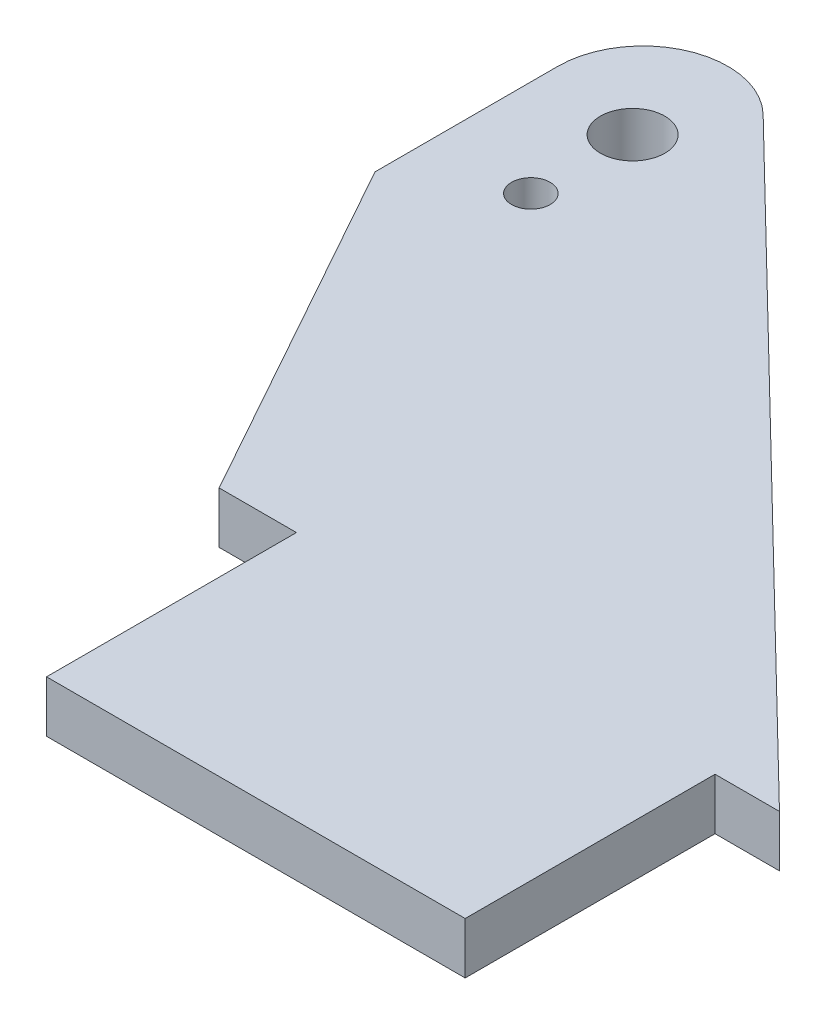
ISO-10303-21;
HEADER;
FILE_DESCRIPTION(('STEP AP214'),'2;1');
FILE_NAME('part.step','',(''),(''),'','','');
FILE_SCHEMA(('AUTOMOTIVE_DESIGN { 1 0 10303 214 1 1 1 1 }'));
ENDSEC;
DATA;
#1=APPLICATION_CONTEXT('core data for automotive mechanical design processes');
#2=APPLICATION_PROTOCOL_DEFINITION('international standard','automotive_design',2000,#1);
#3=PRODUCT_CONTEXT('',#1,'mechanical');
#4=PRODUCT('Part','Part','',(#3));
#5=PRODUCT_RELATED_PRODUCT_CATEGORY('part','',(#4));
#6=PRODUCT_DEFINITION_FORMATION('','',#4);
#7=PRODUCT_DEFINITION_CONTEXT('part definition',#1,'design');
#8=PRODUCT_DEFINITION('design','',#6,#7);
#9=PRODUCT_DEFINITION_SHAPE('','',#8);
#10=(LENGTH_UNIT() NAMED_UNIT(*) SI_UNIT(.MILLI.,.METRE.));
#11=(NAMED_UNIT(*) PLANE_ANGLE_UNIT() SI_UNIT($,.RADIAN.));
#12=(NAMED_UNIT(*) SI_UNIT($,.STERADIAN.) SOLID_ANGLE_UNIT());
#13=UNCERTAINTY_MEASURE_WITH_UNIT(LENGTH_MEASURE(1.E-05),#10,'distance_accuracy_value','');
#14=(GEOMETRIC_REPRESENTATION_CONTEXT(3) GLOBAL_UNCERTAINTY_ASSIGNED_CONTEXT((#13)) GLOBAL_UNIT_ASSIGNED_CONTEXT((#10,
#11,#12)) REPRESENTATION_CONTEXT('',''));
#15=CARTESIAN_POINT('',(0.,0.,0.));
#16=DIRECTION('',(0.,0.,1.));
#17=DIRECTION('',(1.,0.,0.));
#18=AXIS2_PLACEMENT_3D('',#15,#16,#17);
#19=CARTESIAN_POINT('',(0.,1.016,0.));
#20=DIRECTION('',(1.,0.,0.));
#21=DIRECTION('',(0.,0.,-1.));
#22=AXIS2_PLACEMENT_3D('',#19,#20,#21);
#23=PLANE('',#22);
#24=DIRECTION('',(0.,0.,1.));
#25=VECTOR('',#24,1.);
#26=CARTESIAN_POINT('',(0.,0.,0.));
#27=LINE('',#26,#25);
#28=CARTESIAN_POINT('',(0.,0.,-4.9276));
#29=VERTEX_POINT('',#28);
#30=CARTESIAN_POINT('',(0.,0.,0.));
#31=VERTEX_POINT('',#30);
#32=EDGE_CURVE('E139',#29,#31,#27,.T.);
#33=ORIENTED_EDGE('',*,*,#32,.T.);
#34=DIRECTION('',(0.,-1.,0.));
#35=VECTOR('',#34,1.);
#36=CARTESIAN_POINT('',(0.,1.016,0.));
#37=LINE('',#36,#35);
#38=CARTESIAN_POINT('',(0.,1.016,0.));
#39=VERTEX_POINT('',#38);
#40=EDGE_CURVE('E11',#39,#31,#37,.T.);
#41=ORIENTED_EDGE('',*,*,#40,.F.);
#42=DIRECTION('',(0.,0.,1.));
#43=VECTOR('',#42,1.);
#44=CARTESIAN_POINT('',(0.,1.016,0.));
#45=LINE('',#44,#43);
#46=CARTESIAN_POINT('',(0.,1.016,-4.9276));
#47=VERTEX_POINT('',#46);
#48=EDGE_CURVE('E156',#47,#39,#45,.T.);
#49=ORIENTED_EDGE('',*,*,#48,.F.);
#50=DIRECTION('',(0.,-1.,0.));
#51=VECTOR('',#50,1.);
#52=CARTESIAN_POINT('',(0.,1.016,-4.9276));
#53=LINE('',#52,#51);
#54=EDGE_CURVE('E135',#47,#29,#53,.T.);
#55=ORIENTED_EDGE('',*,*,#54,.T.);
#56=EDGE_LOOP('',(#33,#41,#49,#55));
#57=FACE_BOUND('',#56,.T.);
#58=ADVANCED_FACE('F37',(#57),#23,.F.);
#59=CARTESIAN_POINT('',(0.,1.016,0.));
#60=DIRECTION('',(0.,0.,-1.));
#61=DIRECTION('',(-1.,0.,0.));
#62=AXIS2_PLACEMENT_3D('',#59,#60,#61);
#63=PLANE('',#62);
#64=DIRECTION('',(1.,0.,0.));
#65=VECTOR('',#64,1.);
#66=CARTESIAN_POINT('',(0.,0.,0.));
#67=LINE('',#66,#65);
#68=CARTESIAN_POINT('',(8.255,0.,0.));
#69=VERTEX_POINT('',#68);
#70=EDGE_CURVE('E142',#31,#69,#67,.T.);
#71=ORIENTED_EDGE('',*,*,#70,.T.);
#72=DIRECTION('',(0.,-1.,0.));
#73=VECTOR('',#72,1.);
#74=CARTESIAN_POINT('',(8.255,1.016,0.));
#75=LINE('',#74,#73);
#76=CARTESIAN_POINT('',(8.255,1.016,0.));
#77=VERTEX_POINT('',#76);
#78=EDGE_CURVE('E45',#77,#69,#75,.T.);
#79=ORIENTED_EDGE('',*,*,#78,.F.);
#80=DIRECTION('',(1.,0.,0.));
#81=VECTOR('',#80,1.);
#82=CARTESIAN_POINT('',(0.,1.016,0.));
#83=LINE('',#82,#81);
#84=EDGE_CURVE('E99',#39,#77,#83,.T.);
#85=ORIENTED_EDGE('',*,*,#84,.F.);
#86=ORIENTED_EDGE('',*,*,#40,.T.);
#87=EDGE_LOOP('',(#71,#79,#85,#86));
#88=FACE_BOUND('',#87,.T.);
#89=ADVANCED_FACE('F233',(#88),#63,.F.);
#90=CARTESIAN_POINT('',(8.255,1.016,0.));
#91=DIRECTION('',(-1.,0.,0.));
#92=DIRECTION('',(0.,0.,1.));
#93=AXIS2_PLACEMENT_3D('',#90,#91,#92);
#94=PLANE('',#93);
#95=DIRECTION('',(0.,0.,-1.));
#96=VECTOR('',#95,1.);
#97=CARTESIAN_POINT('',(8.255,0.,0.));
#98=LINE('',#97,#96);
#99=CARTESIAN_POINT('',(8.255,0.,-4.9276));
#100=VERTEX_POINT('',#99);
#101=EDGE_CURVE('E145',#69,#100,#98,.T.);
#102=ORIENTED_EDGE('',*,*,#101,.T.);
#103=DIRECTION('',(0.,-1.,0.));
#104=VECTOR('',#103,1.);
#105=CARTESIAN_POINT('',(8.255,1.016,-4.9276));
#106=LINE('',#105,#104);
#107=CARTESIAN_POINT('',(8.255,1.016,-4.9276));
#108=VERTEX_POINT('',#107);
#109=EDGE_CURVE('E166',#108,#100,#106,.T.);
#110=ORIENTED_EDGE('',*,*,#109,.F.);
#111=DIRECTION('',(0.,0.,-1.));
#112=VECTOR('',#111,1.);
#113=CARTESIAN_POINT('',(8.255,1.016,0.));
#114=LINE('',#113,#112);
#115=EDGE_CURVE('E174',#77,#108,#114,.T.);
#116=ORIENTED_EDGE('',*,*,#115,.F.);
#117=ORIENTED_EDGE('',*,*,#78,.T.);
#118=EDGE_LOOP('',(#102,#110,#116,#117));
#119=FACE_BOUND('',#118,.T.);
#120=ADVANCED_FACE('F172',(#119),#94,.F.);
#121=CARTESIAN_POINT('',(8.255,1.016,-4.9276));
#122=DIRECTION('',(0.,0.,-1.));
#123=DIRECTION('',(-1.,0.,0.));
#124=AXIS2_PLACEMENT_3D('',#121,#122,#123);
#125=PLANE('',#124);
#126=DIRECTION('',(1.,0.,0.));
#127=VECTOR('',#126,1.);
#128=CARTESIAN_POINT('',(8.255,0.,-4.9276));
#129=LINE('',#128,#127);
#130=CARTESIAN_POINT('',(9.525,0.,-4.9276));
#131=VERTEX_POINT('',#130);
#132=EDGE_CURVE('E147',#100,#131,#129,.T.);
#133=ORIENTED_EDGE('',*,*,#132,.T.);
#134=DIRECTION('',(0.,-1.,0.));
#135=VECTOR('',#134,1.);
#136=CARTESIAN_POINT('',(9.525,1.016,-4.9276));
#137=LINE('',#136,#135);
#138=CARTESIAN_POINT('',(9.525,1.016,-4.9276));
#139=VERTEX_POINT('',#138);
#140=EDGE_CURVE('E163',#139,#131,#137,.T.);
#141=ORIENTED_EDGE('',*,*,#140,.F.);
#142=DIRECTION('',(1.,0.,0.));
#143=VECTOR('',#142,1.);
#144=CARTESIAN_POINT('',(8.255,1.016,-4.9276));
#145=LINE('',#144,#143);
#146=EDGE_CURVE('E190',#108,#139,#145,.T.);
#147=ORIENTED_EDGE('',*,*,#146,.F.);
#148=ORIENTED_EDGE('',*,*,#109,.T.);
#149=EDGE_LOOP('',(#133,#141,#147,#148));
#150=FACE_BOUND('',#149,.T.);
#151=ADVANCED_FACE('F183',(#150),#125,.F.);
#152=CARTESIAN_POINT('',(9.525,1.016,-4.9276));
#153=DIRECTION('',(-0.69748398227147,0.,0.716600372923942));
#154=DIRECTION('',(0.716600372923942,0.,0.69748398227147));
#155=AXIS2_PLACEMENT_3D('',#152,#153,#154);
#156=PLANE('',#155);
#157=DIRECTION('',(-0.716600372923942,0.,-0.69748398227147));
#158=VECTOR('',#157,1.);
#159=CARTESIAN_POINT('',(9.525,0.,-4.9276));
#160=LINE('',#159,#158);
#161=CARTESIAN_POINT('',(-2.5391378521201,0.,-16.6699088651697));
#162=VERTEX_POINT('',#161);
#163=EDGE_CURVE('E149',#131,#162,#160,.T.);
#164=ORIENTED_EDGE('',*,*,#163,.T.);
#165=DIRECTION('',(0.,-1.,0.));
#166=VECTOR('',#165,1.);
#167=CARTESIAN_POINT('',(-2.5391378521201,1.016,-16.6699088651697));
#168=LINE('',#167,#166);
#169=CARTESIAN_POINT('',(-2.5391378521201,1.016,-16.6699088651697));
#170=VERTEX_POINT('',#169);
#171=EDGE_CURVE('E160',#170,#162,#168,.T.);
#172=ORIENTED_EDGE('',*,*,#171,.F.);
#173=DIRECTION('',(-0.716600372923942,0.,-0.69748398227147));
#174=VECTOR('',#173,1.);
#175=CARTESIAN_POINT('',(9.525,1.016,-4.9276));
#176=LINE('',#175,#174);
#177=EDGE_CURVE('E189',#139,#170,#176,.T.);
#178=ORIENTED_EDGE('',*,*,#177,.F.);
#179=ORIENTED_EDGE('',*,*,#140,.T.);
#180=EDGE_LOOP('',(#164,#172,#178,#179));
#181=FACE_BOUND('',#180,.T.);
#182=ADVANCED_FACE('F187',(#181),#156,.F.);
#183=CARTESIAN_POINT('',(-3.7084,1.016,-15.4686));
#184=DIRECTION('',(0.,-1.,0.));
#185=DIRECTION('',(0.,0.,-1.));
#186=AXIS2_PLACEMENT_3D('',#183,#184,#185);
#187=CYLINDRICAL_SURFACE('',#186,1.6764);
#188=CARTESIAN_POINT('',(-3.7084,0.,-15.4686));
#189=DIRECTION('',(0.,1.,0.));
#190=DIRECTION('',(0.,0.,-1.));
#191=AXIS2_PLACEMENT_3D('',#188,#189,#190);
#192=CIRCLE('',#191,1.6764);
#193=CARTESIAN_POINT('',(-5.38479999999999,0.,-15.4686));
#194=VERTEX_POINT('',#193);
#195=EDGE_CURVE('E151',#162,#194,#192,.T.);
#196=ORIENTED_EDGE('',*,*,#195,.T.);
#197=DIRECTION('',(0.,-1.,0.));
#198=VECTOR('',#197,1.);
#199=CARTESIAN_POINT('',(-5.38479999999999,1.016,-15.4686));
#200=LINE('',#199,#198);
#201=CARTESIAN_POINT('',(-5.38479999999999,1.016,-15.4686));
#202=VERTEX_POINT('',#201);
#203=EDGE_CURVE('E130',#202,#194,#200,.T.);
#204=ORIENTED_EDGE('',*,*,#203,.F.);
#205=CARTESIAN_POINT('',(-3.7084,1.016,-15.4686));
#206=DIRECTION('',(0.,1.,0.));
#207=DIRECTION('',(0.,0.,-1.));
#208=AXIS2_PLACEMENT_3D('',#205,#206,#207);
#209=CIRCLE('',#208,1.6764);
#210=EDGE_CURVE('E121',#170,#202,#209,.T.);
#211=ORIENTED_EDGE('',*,*,#210,.F.);
#212=ORIENTED_EDGE('',*,*,#171,.T.);
#213=EDGE_LOOP('',(#196,#204,#211,#212));
#214=FACE_BOUND('',#213,.T.);
#215=ADVANCED_FACE('F241',(#214),#187,.T.);
#216=CARTESIAN_POINT('',(-5.3848,1.016,-11.8618));
#217=DIRECTION('',(1.,0.,0.));
#218=DIRECTION('',(0.,0.,-1.));
#219=AXIS2_PLACEMENT_3D('',#216,#217,#218);
#220=PLANE('',#219);
#221=DIRECTION('',(0.,0.,1.));
#222=VECTOR('',#221,1.);
#223=CARTESIAN_POINT('',(-5.3848,0.,-11.8618));
#224=LINE('',#223,#222);
#225=CARTESIAN_POINT('',(-5.3848,0.,-11.8618));
#226=VERTEX_POINT('',#225);
#227=EDGE_CURVE('E129',#194,#226,#224,.T.);
#228=ORIENTED_EDGE('',*,*,#227,.T.);
#229=DIRECTION('',(0.,-1.,0.));
#230=VECTOR('',#229,1.);
#231=CARTESIAN_POINT('',(-5.3848,1.016,-11.8618));
#232=LINE('',#231,#230);
#233=CARTESIAN_POINT('',(-5.3848,1.016,-11.8618));
#234=VERTEX_POINT('',#233);
#235=EDGE_CURVE('E126',#234,#226,#232,.T.);
#236=ORIENTED_EDGE('',*,*,#235,.F.);
#237=DIRECTION('',(0.,0.,1.));
#238=VECTOR('',#237,1.);
#239=CARTESIAN_POINT('',(-5.3848,1.016,-11.8618));
#240=LINE('',#239,#238);
#241=EDGE_CURVE('E115',#202,#234,#240,.T.);
#242=ORIENTED_EDGE('',*,*,#241,.F.);
#243=ORIENTED_EDGE('',*,*,#203,.T.);
#244=EDGE_LOOP('',(#228,#236,#242,#243));
#245=FACE_BOUND('',#244,.T.);
#246=ADVANCED_FACE('F127',(#245),#220,.F.);
#247=CARTESIAN_POINT('',(-1.524,1.016,-4.9276));
#248=DIRECTION('',(0.873704011916736,0.,-0.486457911396864));
#249=DIRECTION('',(-0.486457911396864,0.,-0.873704011916737));
#250=AXIS2_PLACEMENT_3D('',#247,#248,#249);
#251=PLANE('',#250);
#252=DIRECTION('',(0.486457911396864,0.,0.873704011916736));
#253=VECTOR('',#252,1.);
#254=CARTESIAN_POINT('',(-1.524,0.,-4.9276));
#255=LINE('',#254,#253);
#256=CARTESIAN_POINT('',(-1.524,0.,-4.9276));
#257=VERTEX_POINT('',#256);
#258=EDGE_CURVE('E85',#226,#257,#255,.T.);
#259=ORIENTED_EDGE('',*,*,#258,.T.);
#260=DIRECTION('',(0.,-1.,0.));
#261=VECTOR('',#260,1.);
#262=CARTESIAN_POINT('',(-1.524,1.016,-4.9276));
#263=LINE('',#262,#261);
#264=CARTESIAN_POINT('',(-1.524,1.016,-4.9276));
#265=VERTEX_POINT('',#264);
#266=EDGE_CURVE('E131',#265,#257,#263,.T.);
#267=ORIENTED_EDGE('',*,*,#266,.F.);
#268=DIRECTION('',(0.486457911396864,0.,0.873704011916736));
#269=VECTOR('',#268,1.);
#270=CARTESIAN_POINT('',(-1.524,1.016,-4.9276));
#271=LINE('',#270,#269);
#272=EDGE_CURVE('E119',#234,#265,#271,.T.);
#273=ORIENTED_EDGE('',*,*,#272,.F.);
#274=ORIENTED_EDGE('',*,*,#235,.T.);
#275=EDGE_LOOP('',(#259,#267,#273,#274));
#276=FACE_BOUND('',#275,.T.);
#277=ADVANCED_FACE('F133',(#276),#251,.F.);
#278=CARTESIAN_POINT('',(0.,1.016,-4.9276));
#279=DIRECTION('',(0.,0.,-1.));
#280=DIRECTION('',(-1.,0.,0.));
#281=AXIS2_PLACEMENT_3D('',#278,#279,#280);
#282=PLANE('',#281);
#283=DIRECTION('',(1.,0.,0.));
#284=VECTOR('',#283,1.);
#285=CARTESIAN_POINT('',(0.,0.,-4.9276));
#286=LINE('',#285,#284);
#287=EDGE_CURVE('E91',#257,#29,#286,.T.);
#288=ORIENTED_EDGE('',*,*,#287,.T.);
#289=ORIENTED_EDGE('',*,*,#54,.F.);
#290=DIRECTION('',(1.,0.,0.));
#291=VECTOR('',#290,1.);
#292=CARTESIAN_POINT('',(0.,1.016,-4.9276));
#293=LINE('',#292,#291);
#294=EDGE_CURVE('E53',#265,#47,#293,.T.);
#295=ORIENTED_EDGE('',*,*,#294,.F.);
#296=ORIENTED_EDGE('',*,*,#266,.T.);
#297=EDGE_LOOP('',(#288,#289,#295,#296));
#298=FACE_BOUND('',#297,.T.);
#299=ADVANCED_FACE('F220',(#298),#282,.F.);
#300=CARTESIAN_POINT('',(-3.7084,1.016,-15.4686));
#301=DIRECTION('',(0.,-1.,0.));
#302=DIRECTION('',(0.,0.,-1.));
#303=AXIS2_PLACEMENT_3D('',#300,#301,#302);
#304=PLANE('',#303);
#305=CARTESIAN_POINT('',(-3.47979999999999,1.016,-13.0302));
#306=DIRECTION('',(0.,1.,0.));
#307=DIRECTION('',(0.,0.,1.));
#308=AXIS2_PLACEMENT_3D('',#305,#306,#307);
#309=CIRCLE('',#308,0.381);
#310=CARTESIAN_POINT('',(-3.47979999999999,1.016,-12.6492));
#311=VERTEX_POINT('',#310);
#312=EDGE_CURVE('E203',#311,#311,#309,.T.);
#313=ORIENTED_EDGE('',*,*,#312,.F.);
#314=EDGE_LOOP('',(#313));
#315=FACE_BOUND('',#314,.T.);
#316=CARTESIAN_POINT('',(-3.47979999999999,1.016,-15.0368));
#317=DIRECTION('',(0.,1.,0.));
#318=DIRECTION('',(0.,0.,1.));
#319=AXIS2_PLACEMENT_3D('',#316,#317,#318);
#320=CIRCLE('',#319,0.635);
#321=CARTESIAN_POINT('',(-3.47979999999999,1.016,-14.4018));
#322=VERTEX_POINT('',#321);
#323=EDGE_CURVE('E197',#322,#322,#320,.T.);
#324=ORIENTED_EDGE('',*,*,#323,.F.);
#325=EDGE_LOOP('',(#324));
#326=FACE_BOUND('',#325,.T.);
#327=ORIENTED_EDGE('',*,*,#48,.T.);
#328=ORIENTED_EDGE('',*,*,#84,.T.);
#329=ORIENTED_EDGE('',*,*,#115,.T.);
#330=ORIENTED_EDGE('',*,*,#146,.T.);
#331=ORIENTED_EDGE('',*,*,#177,.T.);
#332=ORIENTED_EDGE('',*,*,#210,.T.);
#333=ORIENTED_EDGE('',*,*,#241,.T.);
#334=ORIENTED_EDGE('',*,*,#272,.T.);
#335=ORIENTED_EDGE('',*,*,#294,.T.);
#336=EDGE_LOOP('',(#327,#328,#329,#330,#331,#332,#333,#334,#335));
#337=FACE_BOUND('',#336,.T.);
#338=ADVANCED_FACE('F117',(#315,#326,#337),#304,.F.);
#339=CARTESIAN_POINT('',(-3.7084,0.,-15.4686));
#340=DIRECTION('',(0.,-1.,0.));
#341=DIRECTION('',(0.,0.,-1.));
#342=AXIS2_PLACEMENT_3D('',#339,#340,#341);
#343=PLANE('',#342);
#344=CARTESIAN_POINT('',(-3.47979999999999,0.,-13.0302));
#345=DIRECTION('',(0.,1.,0.));
#346=DIRECTION('',(0.,0.,1.));
#347=AXIS2_PLACEMENT_3D('',#344,#345,#346);
#348=CIRCLE('',#347,0.381);
#349=CARTESIAN_POINT('',(-3.47979999999999,0.,-12.6492));
#350=VERTEX_POINT('',#349);
#351=EDGE_CURVE('E200',#350,#350,#348,.T.);
#352=ORIENTED_EDGE('',*,*,#351,.T.);
#353=EDGE_LOOP('',(#352));
#354=FACE_BOUND('',#353,.T.);
#355=CARTESIAN_POINT('',(-3.47979999999999,0.,-15.0368));
#356=DIRECTION('',(0.,1.,0.));
#357=DIRECTION('',(0.,0.,1.));
#358=AXIS2_PLACEMENT_3D('',#355,#356,#357);
#359=CIRCLE('',#358,0.635);
#360=CARTESIAN_POINT('',(-3.47979999999999,0.,-14.4018));
#361=VERTEX_POINT('',#360);
#362=EDGE_CURVE('E143',#361,#361,#359,.T.);
#363=ORIENTED_EDGE('',*,*,#362,.T.);
#364=EDGE_LOOP('',(#363));
#365=FACE_BOUND('',#364,.T.);
#366=ORIENTED_EDGE('',*,*,#32,.F.);
#367=ORIENTED_EDGE('',*,*,#287,.F.);
#368=ORIENTED_EDGE('',*,*,#258,.F.);
#369=ORIENTED_EDGE('',*,*,#227,.F.);
#370=ORIENTED_EDGE('',*,*,#195,.F.);
#371=ORIENTED_EDGE('',*,*,#163,.F.);
#372=ORIENTED_EDGE('',*,*,#132,.F.);
#373=ORIENTED_EDGE('',*,*,#101,.F.);
#374=ORIENTED_EDGE('',*,*,#70,.F.);
#375=EDGE_LOOP('',(#366,#367,#368,#369,#370,#371,#372,#373,#374));
#376=FACE_BOUND('',#375,.T.);
#377=ADVANCED_FACE('F178',(#354,#365,#376),#343,.T.);
#378=CARTESIAN_POINT('',(-3.47979999999999,0.,-15.0368));
#379=DIRECTION('',(0.,1.,0.));
#380=DIRECTION('',(0.,0.,1.));
#381=AXIS2_PLACEMENT_3D('',#378,#379,#380);
#382=CYLINDRICAL_SURFACE('',#381,0.635);
#383=ORIENTED_EDGE('',*,*,#362,.F.);
#384=EDGE_LOOP('',(#383));
#385=FACE_BOUND('',#384,.T.);
#386=ORIENTED_EDGE('',*,*,#323,.T.);
#387=EDGE_LOOP('',(#386));
#388=FACE_BOUND('',#387,.T.);
#389=ADVANCED_FACE('F214',(#385,#388),#382,.F.);
#390=CARTESIAN_POINT('',(-3.47979999999999,0.,-13.0302));
#391=DIRECTION('',(0.,1.,0.));
#392=DIRECTION('',(0.,0.,1.));
#393=AXIS2_PLACEMENT_3D('',#390,#391,#392);
#394=CYLINDRICAL_SURFACE('',#393,0.381);
#395=ORIENTED_EDGE('',*,*,#351,.F.);
#396=EDGE_LOOP('',(#395));
#397=FACE_BOUND('',#396,.T.);
#398=ORIENTED_EDGE('',*,*,#312,.T.);
#399=EDGE_LOOP('',(#398));
#400=FACE_BOUND('',#399,.T.);
#401=ADVANCED_FACE('F211',(#397,#400),#394,.F.);
#402=CLOSED_SHELL('',(#58,#89,#120,#151,#182,#215,#246,#277,#299,#338,#377,#389,#401));
#403=MANIFOLD_SOLID_BREP('B2',#402);
#404=ADVANCED_BREP_SHAPE_REPRESENTATION('',(#18,#403),#14);
#405=SHAPE_DEFINITION_REPRESENTATION(#9,#404);
ENDSEC;
END-ISO-10303-21;
